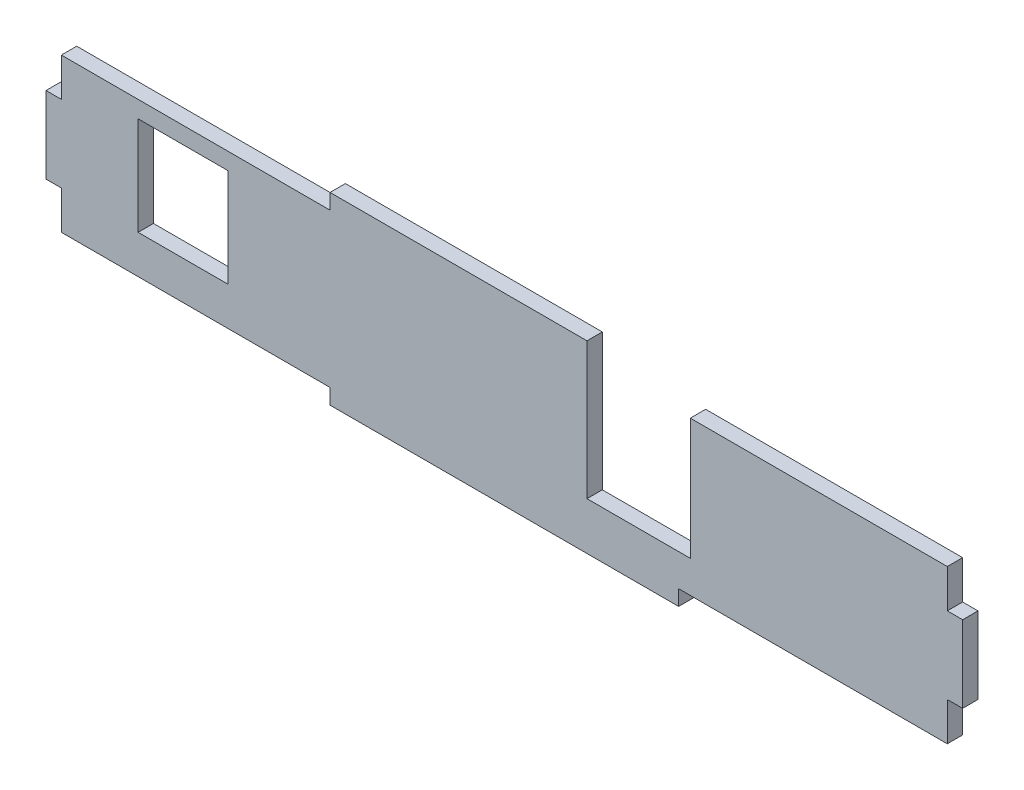
ISO-10303-21;
HEADER;
FILE_DESCRIPTION(('STEP AP214'),'2;1');
FILE_NAME('part.step','',(''),(''),'','','');
FILE_SCHEMA(('AUTOMOTIVE_DESIGN { 1 0 10303 214 1 1 1 1 }'));
ENDSEC;
DATA;
#1=APPLICATION_CONTEXT('core data for automotive mechanical design processes');
#2=APPLICATION_PROTOCOL_DEFINITION('international standard','automotive_design',2000,#1);
#3=PRODUCT_CONTEXT('',#1,'mechanical');
#4=PRODUCT('Part','Part','',(#3));
#5=PRODUCT_RELATED_PRODUCT_CATEGORY('part','',(#4));
#6=PRODUCT_DEFINITION_FORMATION('','',#4);
#7=PRODUCT_DEFINITION_CONTEXT('part definition',#1,'design');
#8=PRODUCT_DEFINITION('design','',#6,#7);
#9=PRODUCT_DEFINITION_SHAPE('','',#8);
#10=(LENGTH_UNIT() NAMED_UNIT(*) SI_UNIT(.MILLI.,.METRE.));
#11=(NAMED_UNIT(*) PLANE_ANGLE_UNIT() SI_UNIT($,.RADIAN.));
#12=(NAMED_UNIT(*) SI_UNIT($,.STERADIAN.) SOLID_ANGLE_UNIT());
#13=UNCERTAINTY_MEASURE_WITH_UNIT(LENGTH_MEASURE(1.E-05),#10,'distance_accuracy_value','');
#14=(GEOMETRIC_REPRESENTATION_CONTEXT(3) GLOBAL_UNCERTAINTY_ASSIGNED_CONTEXT((#13)) GLOBAL_UNIT_ASSIGNED_CONTEXT((#10,
#11,#12)) REPRESENTATION_CONTEXT('',''));
#15=CARTESIAN_POINT('',(0.,0.,0.));
#16=DIRECTION('',(0.,0.,1.));
#17=DIRECTION('',(1.,0.,0.));
#18=AXIS2_PLACEMENT_3D('',#15,#16,#17);
#19=CARTESIAN_POINT('',(0.,0.,2.));
#20=DIRECTION('',(0.,0.,1.));
#21=DIRECTION('',(1.,0.,0.));
#22=AXIS2_PLACEMENT_3D('',#19,#20,#21);
#23=PLANE('',#22);
#24=DIRECTION('',(0.,-1.,0.));
#25=VECTOR('',#24,1.);
#26=CARTESIAN_POINT('',(0.,0.,2.));
#27=LINE('',#26,#25);
#28=CARTESIAN_POINT('',(0.,5.,2.));
#29=VERTEX_POINT('',#28);
#30=CARTESIAN_POINT('',(0.,0.,2.));
#31=VERTEX_POINT('',#30);
#32=EDGE_CURVE('E244',#29,#31,#27,.T.);
#33=ORIENTED_EDGE('',*,*,#32,.T.);
#34=DIRECTION('',(1.,0.,0.));
#35=VECTOR('',#34,1.);
#36=CARTESIAN_POINT('',(0.,0.,2.));
#37=LINE('',#36,#35);
#38=CARTESIAN_POINT('',(35.,0.,2.));
#39=VERTEX_POINT('',#38);
#40=EDGE_CURVE('E247',#31,#39,#37,.T.);
#41=ORIENTED_EDGE('',*,*,#40,.T.);
#42=DIRECTION('',(0.,-1.,0.));
#43=VECTOR('',#42,1.);
#44=CARTESIAN_POINT('',(35.,0.,2.));
#45=LINE('',#44,#43);
#46=CARTESIAN_POINT('',(35.,-2.00047159609551,2.));
#47=VERTEX_POINT('',#46);
#48=EDGE_CURVE('E250',#39,#47,#45,.T.);
#49=ORIENTED_EDGE('',*,*,#48,.T.);
#50=DIRECTION('',(1.,0.,0.));
#51=VECTOR('',#50,1.);
#52=CARTESIAN_POINT('',(35.,-2.00047159609551,2.));
#53=LINE('',#52,#51);
#54=CARTESIAN_POINT('',(80.41,-2.00047159609551,2.));
#55=VERTEX_POINT('',#54);
#56=EDGE_CURVE('E252',#47,#55,#53,.T.);
#57=ORIENTED_EDGE('',*,*,#56,.T.);
#58=DIRECTION('',(0.,1.,0.));
#59=VECTOR('',#58,1.);
#60=CARTESIAN_POINT('',(80.41,-2.00047159609551,2.));
#61=LINE('',#60,#59);
#62=CARTESIAN_POINT('',(80.41,0.,2.));
#63=VERTEX_POINT('',#62);
#64=EDGE_CURVE('E254',#55,#63,#61,.T.);
#65=ORIENTED_EDGE('',*,*,#64,.T.);
#66=DIRECTION('',(1.,0.,0.));
#67=VECTOR('',#66,1.);
#68=CARTESIAN_POINT('',(80.41,0.,2.));
#69=LINE('',#68,#67);
#70=CARTESIAN_POINT('',(115.41,0.,2.));
#71=VERTEX_POINT('',#70);
#72=EDGE_CURVE('E256',#63,#71,#69,.T.);
#73=ORIENTED_EDGE('',*,*,#72,.T.);
#74=DIRECTION('',(0.,1.,0.));
#75=VECTOR('',#74,1.);
#76=CARTESIAN_POINT('',(115.41,0.,2.));
#77=LINE('',#76,#75);
#78=CARTESIAN_POINT('',(115.41,5.,2.));
#79=VERTEX_POINT('',#78);
#80=EDGE_CURVE('E258',#71,#79,#77,.T.);
#81=ORIENTED_EDGE('',*,*,#80,.T.);
#82=DIRECTION('',(1.,0.,0.));
#83=VECTOR('',#82,1.);
#84=CARTESIAN_POINT('',(115.41,5.,2.));
#85=LINE('',#84,#83);
#86=CARTESIAN_POINT('',(117.41,5.,2.));
#87=VERTEX_POINT('',#86);
#88=EDGE_CURVE('E260',#79,#87,#85,.T.);
#89=ORIENTED_EDGE('',*,*,#88,.T.);
#90=DIRECTION('',(0.,1.,0.));
#91=VECTOR('',#90,1.);
#92=CARTESIAN_POINT('',(117.41,5.,2.));
#93=LINE('',#92,#91);
#94=CARTESIAN_POINT('',(117.41,15.,2.));
#95=VERTEX_POINT('',#94);
#96=EDGE_CURVE('E262',#87,#95,#93,.T.);
#97=ORIENTED_EDGE('',*,*,#96,.T.);
#98=DIRECTION('',(-1.,0.,0.));
#99=VECTOR('',#98,1.);
#100=CARTESIAN_POINT('',(117.41,15.,2.));
#101=LINE('',#100,#99);
#102=CARTESIAN_POINT('',(115.409999943228,15.,2.));
#103=VERTEX_POINT('',#102);
#104=EDGE_CURVE('E264',#95,#103,#101,.T.);
#105=ORIENTED_EDGE('',*,*,#104,.T.);
#106=DIRECTION('',(0.,1.,0.));
#107=VECTOR('',#106,1.);
#108=CARTESIAN_POINT('',(115.409999943228,15.,2.));
#109=LINE('',#108,#107);
#110=CARTESIAN_POINT('',(115.409999943228,20.0036199747844,2.));
#111=VERTEX_POINT('',#110);
#112=EDGE_CURVE('E266',#103,#111,#109,.T.);
#113=ORIENTED_EDGE('',*,*,#112,.T.);
#114=DIRECTION('',(-1.,0.,0.));
#115=VECTOR('',#114,1.);
#116=CARTESIAN_POINT('',(81.9297207735588,20.0036199747844,2.));
#117=LINE('',#116,#115);
#118=CARTESIAN_POINT('',(81.9297207735588,20.0036199747844,2.));
#119=VERTEX_POINT('',#118);
#120=EDGE_CURVE('E268',#111,#119,#117,.T.);
#121=ORIENTED_EDGE('',*,*,#120,.T.);
#122=DIRECTION('',(0.,-1.,0.));
#123=VECTOR('',#122,1.);
#124=CARTESIAN_POINT('',(81.9297207735588,20.0036199747844,2.));
#125=LINE('',#124,#123);
#126=CARTESIAN_POINT('',(81.9297207735588,4.18921696791718,2.));
#127=VERTEX_POINT('',#126);
#128=EDGE_CURVE('E270',#119,#127,#125,.T.);
#129=ORIENTED_EDGE('',*,*,#128,.T.);
#130=DIRECTION('',(-1.,0.,0.));
#131=VECTOR('',#130,1.);
#132=CARTESIAN_POINT('',(68.4730931683228,4.18921696791718,2.));
#133=LINE('',#132,#131);
#134=CARTESIAN_POINT('',(68.4730931683228,4.18921696791718,2.));
#135=VERTEX_POINT('',#134);
#136=EDGE_CURVE('E272',#127,#135,#133,.T.);
#137=ORIENTED_EDGE('',*,*,#136,.T.);
#138=DIRECTION('',(0.,1.,0.));
#139=VECTOR('',#138,1.);
#140=CARTESIAN_POINT('',(68.4730931683228,4.18921696791718,2.));
#141=LINE('',#140,#139);
#142=CARTESIAN_POINT('',(68.4730931683228,22.,2.));
#143=VERTEX_POINT('',#142);
#144=EDGE_CURVE('E274',#135,#143,#141,.T.);
#145=ORIENTED_EDGE('',*,*,#144,.T.);
#146=DIRECTION('',(-1.,0.,0.));
#147=VECTOR('',#146,1.);
#148=CARTESIAN_POINT('',(35.,22.,2.));
#149=LINE('',#148,#147);
#150=CARTESIAN_POINT('',(35.,22.,2.));
#151=VERTEX_POINT('',#150);
#152=EDGE_CURVE('E276',#143,#151,#149,.T.);
#153=ORIENTED_EDGE('',*,*,#152,.T.);
#154=DIRECTION('',(0.,-1.,0.));
#155=VECTOR('',#154,1.);
#156=CARTESIAN_POINT('',(35.,22.,2.));
#157=LINE('',#156,#155);
#158=CARTESIAN_POINT('',(35.,20.,2.));
#159=VERTEX_POINT('',#158);
#160=EDGE_CURVE('E278',#151,#159,#157,.T.);
#161=ORIENTED_EDGE('',*,*,#160,.T.);
#162=DIRECTION('',(-1.,0.,0.));
#163=VECTOR('',#162,1.);
#164=CARTESIAN_POINT('',(0.,20.,2.));
#165=LINE('',#164,#163);
#166=CARTESIAN_POINT('',(0.,20.,2.));
#167=VERTEX_POINT('',#166);
#168=EDGE_CURVE('E280',#159,#167,#165,.T.);
#169=ORIENTED_EDGE('',*,*,#168,.T.);
#170=DIRECTION('',(0.,-1.,0.));
#171=VECTOR('',#170,1.);
#172=CARTESIAN_POINT('',(0.,15.,2.));
#173=LINE('',#172,#171);
#174=CARTESIAN_POINT('',(0.,15.,2.));
#175=VERTEX_POINT('',#174);
#176=EDGE_CURVE('E282',#167,#175,#173,.T.);
#177=ORIENTED_EDGE('',*,*,#176,.T.);
#178=DIRECTION('',(-1.,0.,0.));
#179=VECTOR('',#178,1.);
#180=CARTESIAN_POINT('',(-2.,15.,2.));
#181=LINE('',#180,#179);
#182=CARTESIAN_POINT('',(-2.,15.,2.));
#183=VERTEX_POINT('',#182);
#184=EDGE_CURVE('E284',#175,#183,#181,.T.);
#185=ORIENTED_EDGE('',*,*,#184,.T.);
#186=DIRECTION('',(0.,-1.,0.));
#187=VECTOR('',#186,1.);
#188=CARTESIAN_POINT('',(-2.,5.,2.));
#189=LINE('',#188,#187);
#190=CARTESIAN_POINT('',(-2.,5.,2.));
#191=VERTEX_POINT('',#190);
#192=EDGE_CURVE('E286',#183,#191,#189,.T.);
#193=ORIENTED_EDGE('',*,*,#192,.T.);
#194=DIRECTION('',(1.,0.,0.));
#195=VECTOR('',#194,1.);
#196=CARTESIAN_POINT('',(0.,5.,2.));
#197=LINE('',#196,#195);
#198=EDGE_CURVE('E288',#191,#29,#197,.T.);
#199=ORIENTED_EDGE('',*,*,#198,.T.);
#200=EDGE_LOOP('',(#33,#41,#49,#57,#65,#73,#81,#89,#97,#105,#113,#121,#129,#137,#145,#153,#161,
#169,#177,#185,#193,#199));
#201=FACE_BOUND('',#200,.T.);
#202=DIRECTION('',(1.,0.,0.));
#203=VECTOR('',#202,1.);
#204=CARTESIAN_POINT('',(10.,5.,2.));
#205=LINE('',#204,#203);
#206=CARTESIAN_POINT('',(10.,5.,2.));
#207=VERTEX_POINT('',#206);
#208=CARTESIAN_POINT('',(21.695168442494,5.,2.));
#209=VERTEX_POINT('',#208);
#210=EDGE_CURVE('E216',#207,#209,#205,.T.);
#211=ORIENTED_EDGE('',*,*,#210,.F.);
#212=DIRECTION('',(0.,-1.,0.));
#213=VECTOR('',#212,1.);
#214=CARTESIAN_POINT('',(10.,5.,2.));
#215=LINE('',#214,#213);
#216=CARTESIAN_POINT('',(10.,17.8079444644972,2.));
#217=VERTEX_POINT('',#216);
#218=EDGE_CURVE('E208',#217,#207,#215,.T.);
#219=ORIENTED_EDGE('',*,*,#218,.F.);
#220=DIRECTION('',(-1.,0.,0.));
#221=VECTOR('',#220,1.);
#222=CARTESIAN_POINT('',(10.,17.8079444644972,2.));
#223=LINE('',#222,#221);
#224=CARTESIAN_POINT('',(21.695168442494,17.8079444644972,2.));
#225=VERTEX_POINT('',#224);
#226=EDGE_CURVE('E230',#225,#217,#223,.T.);
#227=ORIENTED_EDGE('',*,*,#226,.F.);
#228=DIRECTION('',(0.,1.,0.));
#229=VECTOR('',#228,1.);
#230=CARTESIAN_POINT('',(21.695168442494,5.,2.));
#231=LINE('',#230,#229);
#232=EDGE_CURVE('E228',#209,#225,#231,.T.);
#233=ORIENTED_EDGE('',*,*,#232,.F.);
#234=EDGE_LOOP('',(#211,#219,#227,#233));
#235=FACE_BOUND('',#234,.T.);
#236=ADVANCED_FACE('F35',(#201,#235),#23,.T.);
#237=CARTESIAN_POINT('',(0.,0.,0.));
#238=DIRECTION('',(0.,0.,1.));
#239=DIRECTION('',(1.,0.,0.));
#240=AXIS2_PLACEMENT_3D('',#237,#238,#239);
#241=PLANE('',#240);
#242=DIRECTION('',(0.,-1.,0.));
#243=VECTOR('',#242,1.);
#244=CARTESIAN_POINT('',(0.,0.,0.));
#245=LINE('',#244,#243);
#246=CARTESIAN_POINT('',(0.,5.,0.));
#247=VERTEX_POINT('',#246);
#248=CARTESIAN_POINT('',(0.,0.,0.));
#249=VERTEX_POINT('',#248);
#250=EDGE_CURVE('E224',#247,#249,#245,.T.);
#251=ORIENTED_EDGE('',*,*,#250,.F.);
#252=DIRECTION('',(1.,0.,0.));
#253=VECTOR('',#252,1.);
#254=CARTESIAN_POINT('',(0.,5.,0.));
#255=LINE('',#254,#253);
#256=CARTESIAN_POINT('',(-2.,5.,0.));
#257=VERTEX_POINT('',#256);
#258=EDGE_CURVE('E248',#257,#247,#255,.T.);
#259=ORIENTED_EDGE('',*,*,#258,.F.);
#260=DIRECTION('',(0.,-1.,0.));
#261=VECTOR('',#260,1.);
#262=CARTESIAN_POINT('',(-2.,5.,0.));
#263=LINE('',#262,#261);
#264=CARTESIAN_POINT('',(-2.,15.,0.));
#265=VERTEX_POINT('',#264);
#266=EDGE_CURVE('E332',#265,#257,#263,.T.);
#267=ORIENTED_EDGE('',*,*,#266,.F.);
#268=DIRECTION('',(-1.,0.,0.));
#269=VECTOR('',#268,1.);
#270=CARTESIAN_POINT('',(-2.,15.,0.));
#271=LINE('',#270,#269);
#272=CARTESIAN_POINT('',(0.,15.,0.));
#273=VERTEX_POINT('',#272);
#274=EDGE_CURVE('E330',#273,#265,#271,.T.);
#275=ORIENTED_EDGE('',*,*,#274,.F.);
#276=DIRECTION('',(0.,-1.,0.));
#277=VECTOR('',#276,1.);
#278=CARTESIAN_POINT('',(0.,15.,0.));
#279=LINE('',#278,#277);
#280=CARTESIAN_POINT('',(0.,20.,0.));
#281=VERTEX_POINT('',#280);
#282=EDGE_CURVE('E328',#281,#273,#279,.T.);
#283=ORIENTED_EDGE('',*,*,#282,.F.);
#284=DIRECTION('',(-1.,0.,0.));
#285=VECTOR('',#284,1.);
#286=CARTESIAN_POINT('',(0.,20.,0.));
#287=LINE('',#286,#285);
#288=CARTESIAN_POINT('',(35.,20.,0.));
#289=VERTEX_POINT('',#288);
#290=EDGE_CURVE('E326',#289,#281,#287,.T.);
#291=ORIENTED_EDGE('',*,*,#290,.F.);
#292=DIRECTION('',(0.,-1.,0.));
#293=VECTOR('',#292,1.);
#294=CARTESIAN_POINT('',(35.,22.,0.));
#295=LINE('',#294,#293);
#296=CARTESIAN_POINT('',(35.,22.,0.));
#297=VERTEX_POINT('',#296);
#298=EDGE_CURVE('E324',#297,#289,#295,.T.);
#299=ORIENTED_EDGE('',*,*,#298,.F.);
#300=DIRECTION('',(-1.,0.,0.));
#301=VECTOR('',#300,1.);
#302=CARTESIAN_POINT('',(35.,22.,0.));
#303=LINE('',#302,#301);
#304=CARTESIAN_POINT('',(68.4730931683228,22.,0.));
#305=VERTEX_POINT('',#304);
#306=EDGE_CURVE('E322',#305,#297,#303,.T.);
#307=ORIENTED_EDGE('',*,*,#306,.F.);
#308=DIRECTION('',(0.,1.,0.));
#309=VECTOR('',#308,1.);
#310=CARTESIAN_POINT('',(68.4730931683228,19.9510677717534,0.));
#311=LINE('',#310,#309);
#312=CARTESIAN_POINT('',(68.4730931683228,4.18921696791718,0.));
#313=VERTEX_POINT('',#312);
#314=EDGE_CURVE('E320',#313,#305,#311,.T.);
#315=ORIENTED_EDGE('',*,*,#314,.F.);
#316=DIRECTION('',(-1.,0.,0.));
#317=VECTOR('',#316,1.);
#318=CARTESIAN_POINT('',(68.4730931683228,4.18921696791718,0.));
#319=LINE('',#318,#317);
#320=CARTESIAN_POINT('',(81.9297207735588,4.18921696791718,0.));
#321=VERTEX_POINT('',#320);
#322=EDGE_CURVE('E317',#321,#313,#319,.T.);
#323=ORIENTED_EDGE('',*,*,#322,.F.);
#324=DIRECTION('',(0.,-1.,0.));
#325=VECTOR('',#324,1.);
#326=CARTESIAN_POINT('',(81.9297207735588,20.0036199747844,0.));
#327=LINE('',#326,#325);
#328=CARTESIAN_POINT('',(81.9297207735588,20.0036199747844,0.));
#329=VERTEX_POINT('',#328);
#330=EDGE_CURVE('E315',#329,#321,#327,.T.);
#331=ORIENTED_EDGE('',*,*,#330,.F.);
#332=DIRECTION('',(-1.,0.,0.));
#333=VECTOR('',#332,1.);
#334=CARTESIAN_POINT('',(81.9297207735588,20.0036199747844,0.));
#335=LINE('',#334,#333);
#336=CARTESIAN_POINT('',(115.409999943228,20.0036199747844,0.));
#337=VERTEX_POINT('',#336);
#338=EDGE_CURVE('E313',#337,#329,#335,.T.);
#339=ORIENTED_EDGE('',*,*,#338,.F.);
#340=DIRECTION('',(0.,1.,0.));
#341=VECTOR('',#340,1.);
#342=CARTESIAN_POINT('',(115.409999943228,15.,0.));
#343=LINE('',#342,#341);
#344=CARTESIAN_POINT('',(115.409999943228,15.,0.));
#345=VERTEX_POINT('',#344);
#346=EDGE_CURVE('E311',#345,#337,#343,.T.);
#347=ORIENTED_EDGE('',*,*,#346,.F.);
#348=DIRECTION('',(-1.,0.,0.));
#349=VECTOR('',#348,1.);
#350=CARTESIAN_POINT('',(117.41,15.,0.));
#351=LINE('',#350,#349);
#352=CARTESIAN_POINT('',(117.41,15.,0.));
#353=VERTEX_POINT('',#352);
#354=EDGE_CURVE('E309',#353,#345,#351,.T.);
#355=ORIENTED_EDGE('',*,*,#354,.F.);
#356=DIRECTION('',(0.,1.,0.));
#357=VECTOR('',#356,1.);
#358=CARTESIAN_POINT('',(117.41,5.,0.));
#359=LINE('',#358,#357);
#360=CARTESIAN_POINT('',(117.41,5.,0.));
#361=VERTEX_POINT('',#360);
#362=EDGE_CURVE('E307',#361,#353,#359,.T.);
#363=ORIENTED_EDGE('',*,*,#362,.F.);
#364=DIRECTION('',(1.,0.,0.));
#365=VECTOR('',#364,1.);
#366=CARTESIAN_POINT('',(115.41,5.,0.));
#367=LINE('',#366,#365);
#368=CARTESIAN_POINT('',(115.41,5.,0.));
#369=VERTEX_POINT('',#368);
#370=EDGE_CURVE('E305',#369,#361,#367,.T.);
#371=ORIENTED_EDGE('',*,*,#370,.F.);
#372=DIRECTION('',(0.,1.,0.));
#373=VECTOR('',#372,1.);
#374=CARTESIAN_POINT('',(115.41,0.,0.));
#375=LINE('',#374,#373);
#376=CARTESIAN_POINT('',(115.41,0.,0.));
#377=VERTEX_POINT('',#376);
#378=EDGE_CURVE('E303',#377,#369,#375,.T.);
#379=ORIENTED_EDGE('',*,*,#378,.F.);
#380=DIRECTION('',(1.,0.,0.));
#381=VECTOR('',#380,1.);
#382=CARTESIAN_POINT('',(80.41,0.,0.));
#383=LINE('',#382,#381);
#384=CARTESIAN_POINT('',(80.41,0.,0.));
#385=VERTEX_POINT('',#384);
#386=EDGE_CURVE('E301',#385,#377,#383,.T.);
#387=ORIENTED_EDGE('',*,*,#386,.F.);
#388=DIRECTION('',(0.,1.,0.));
#389=VECTOR('',#388,1.);
#390=CARTESIAN_POINT('',(80.41,-2.00047159609551,0.));
#391=LINE('',#390,#389);
#392=CARTESIAN_POINT('',(80.41,-2.00047159609551,0.));
#393=VERTEX_POINT('',#392);
#394=EDGE_CURVE('E299',#393,#385,#391,.T.);
#395=ORIENTED_EDGE('',*,*,#394,.F.);
#396=DIRECTION('',(1.,0.,0.));
#397=VECTOR('',#396,1.);
#398=CARTESIAN_POINT('',(35.,-2.00047159609551,0.));
#399=LINE('',#398,#397);
#400=CARTESIAN_POINT('',(35.,-2.00047159609551,0.));
#401=VERTEX_POINT('',#400);
#402=EDGE_CURVE('E297',#401,#393,#399,.T.);
#403=ORIENTED_EDGE('',*,*,#402,.F.);
#404=DIRECTION('',(0.,-1.,0.));
#405=VECTOR('',#404,1.);
#406=CARTESIAN_POINT('',(35.,0.,0.));
#407=LINE('',#406,#405);
#408=CARTESIAN_POINT('',(35.,0.,0.));
#409=VERTEX_POINT('',#408);
#410=EDGE_CURVE('E295',#409,#401,#407,.T.);
#411=ORIENTED_EDGE('',*,*,#410,.F.);
#412=DIRECTION('',(1.,0.,0.));
#413=VECTOR('',#412,1.);
#414=CARTESIAN_POINT('',(0.,0.,0.));
#415=LINE('',#414,#413);
#416=EDGE_CURVE('E293',#249,#409,#415,.T.);
#417=ORIENTED_EDGE('',*,*,#416,.F.);
#418=EDGE_LOOP('',(#251,#259,#267,#275,#283,#291,#299,#307,#315,#323,#331,#339,#347,#355,#363,
#371,#379,#387,#395,#403,#411,#417));
#419=FACE_BOUND('',#418,.T.);
#420=DIRECTION('',(0.,-1.,0.));
#421=VECTOR('',#420,1.);
#422=CARTESIAN_POINT('',(10.,5.,0.));
#423=LINE('',#422,#421);
#424=CARTESIAN_POINT('',(10.,17.8079444644972,0.));
#425=VERTEX_POINT('',#424);
#426=CARTESIAN_POINT('',(10.,5.,0.));
#427=VERTEX_POINT('',#426);
#428=EDGE_CURVE('E58',#425,#427,#423,.T.);
#429=ORIENTED_EDGE('',*,*,#428,.T.);
#430=DIRECTION('',(1.,0.,0.));
#431=VECTOR('',#430,1.);
#432=CARTESIAN_POINT('',(10.,5.,0.));
#433=LINE('',#432,#431);
#434=CARTESIAN_POINT('',(21.695168442494,5.,0.));
#435=VERTEX_POINT('',#434);
#436=EDGE_CURVE('E223',#427,#435,#433,.T.);
#437=ORIENTED_EDGE('',*,*,#436,.T.);
#438=DIRECTION('',(0.,1.,0.));
#439=VECTOR('',#438,1.);
#440=CARTESIAN_POINT('',(21.695168442494,5.,0.));
#441=LINE('',#440,#439);
#442=CARTESIAN_POINT('',(21.695168442494,17.8079444644972,0.));
#443=VERTEX_POINT('',#442);
#444=EDGE_CURVE('E236',#435,#443,#441,.T.);
#445=ORIENTED_EDGE('',*,*,#444,.T.);
#446=DIRECTION('',(-1.,0.,0.));
#447=VECTOR('',#446,1.);
#448=CARTESIAN_POINT('',(10.,17.8079444644972,0.));
#449=LINE('',#448,#447);
#450=EDGE_CURVE('E217',#443,#425,#449,.T.);
#451=ORIENTED_EDGE('',*,*,#450,.T.);
#452=EDGE_LOOP('',(#429,#437,#445,#451));
#453=FACE_BOUND('',#452,.T.);
#454=ADVANCED_FACE('F404',(#419,#453),#241,.F.);
#455=CARTESIAN_POINT('',(0.,0.,2.));
#456=DIRECTION('',(1.,0.,0.));
#457=DIRECTION('',(0.,0.,-1.));
#458=AXIS2_PLACEMENT_3D('',#455,#456,#457);
#459=PLANE('',#458);
#460=ORIENTED_EDGE('',*,*,#250,.T.);
#461=DIRECTION('',(0.,0.,-1.));
#462=VECTOR('',#461,1.);
#463=CARTESIAN_POINT('',(0.,0.,2.));
#464=LINE('',#463,#462);
#465=EDGE_CURVE('E11',#31,#249,#464,.T.);
#466=ORIENTED_EDGE('',*,*,#465,.F.);
#467=ORIENTED_EDGE('',*,*,#32,.F.);
#468=DIRECTION('',(0.,0.,-1.));
#469=VECTOR('',#468,1.);
#470=CARTESIAN_POINT('',(0.,5.,2.));
#471=LINE('',#470,#469);
#472=EDGE_CURVE('E290',#29,#247,#471,.T.);
#473=ORIENTED_EDGE('',*,*,#472,.T.);
#474=EDGE_LOOP('',(#460,#466,#467,#473));
#475=FACE_BOUND('',#474,.T.);
#476=ADVANCED_FACE('F37',(#475),#459,.F.);
#477=CARTESIAN_POINT('',(0.,0.,2.));
#478=DIRECTION('',(0.,1.,0.));
#479=DIRECTION('',(0.,0.,1.));
#480=AXIS2_PLACEMENT_3D('',#477,#478,#479);
#481=PLANE('',#480);
#482=ORIENTED_EDGE('',*,*,#416,.T.);
#483=DIRECTION('',(0.,0.,-1.));
#484=VECTOR('',#483,1.);
#485=CARTESIAN_POINT('',(35.,0.,2.));
#486=LINE('',#485,#484);
#487=EDGE_CURVE('E43',#39,#409,#486,.T.);
#488=ORIENTED_EDGE('',*,*,#487,.F.);
#489=ORIENTED_EDGE('',*,*,#40,.F.);
#490=ORIENTED_EDGE('',*,*,#465,.T.);
#491=EDGE_LOOP('',(#482,#488,#489,#490));
#492=FACE_BOUND('',#491,.T.);
#493=ADVANCED_FACE('F421',(#492),#481,.F.);
#494=CARTESIAN_POINT('',(35.,0.,2.));
#495=DIRECTION('',(1.,0.,0.));
#496=DIRECTION('',(0.,0.,-1.));
#497=AXIS2_PLACEMENT_3D('',#494,#495,#496);
#498=PLANE('',#497);
#499=ORIENTED_EDGE('',*,*,#410,.T.);
#500=DIRECTION('',(0.,0.,-1.));
#501=VECTOR('',#500,1.);
#502=CARTESIAN_POINT('',(35.,-2.00047159609551,2.));
#503=LINE('',#502,#501);
#504=EDGE_CURVE('E391',#47,#401,#503,.T.);
#505=ORIENTED_EDGE('',*,*,#504,.F.);
#506=ORIENTED_EDGE('',*,*,#48,.F.);
#507=ORIENTED_EDGE('',*,*,#487,.T.);
#508=EDGE_LOOP('',(#499,#505,#506,#507));
#509=FACE_BOUND('',#508,.T.);
#510=ADVANCED_FACE('F398',(#509),#498,.F.);
#511=CARTESIAN_POINT('',(35.,-2.00047159609551,2.));
#512=DIRECTION('',(0.,1.,0.));
#513=DIRECTION('',(0.,0.,1.));
#514=AXIS2_PLACEMENT_3D('',#511,#512,#513);
#515=PLANE('',#514);
#516=ORIENTED_EDGE('',*,*,#402,.T.);
#517=DIRECTION('',(0.,0.,-1.));
#518=VECTOR('',#517,1.);
#519=CARTESIAN_POINT('',(80.41,-2.00047159609551,2.));
#520=LINE('',#519,#518);
#521=EDGE_CURVE('E388',#55,#393,#520,.T.);
#522=ORIENTED_EDGE('',*,*,#521,.F.);
#523=ORIENTED_EDGE('',*,*,#56,.F.);
#524=ORIENTED_EDGE('',*,*,#504,.T.);
#525=EDGE_LOOP('',(#516,#522,#523,#524));
#526=FACE_BOUND('',#525,.T.);
#527=ADVANCED_FACE('F410',(#526),#515,.F.);
#528=CARTESIAN_POINT('',(80.41,-2.00047159609551,2.));
#529=DIRECTION('',(-1.,0.,0.));
#530=DIRECTION('',(0.,0.,1.));
#531=AXIS2_PLACEMENT_3D('',#528,#529,#530);
#532=PLANE('',#531);
#533=ORIENTED_EDGE('',*,*,#394,.T.);
#534=DIRECTION('',(0.,0.,-1.));
#535=VECTOR('',#534,1.);
#536=CARTESIAN_POINT('',(80.41,0.,2.));
#537=LINE('',#536,#535);
#538=EDGE_CURVE('E385',#63,#385,#537,.T.);
#539=ORIENTED_EDGE('',*,*,#538,.F.);
#540=ORIENTED_EDGE('',*,*,#64,.F.);
#541=ORIENTED_EDGE('',*,*,#521,.T.);
#542=EDGE_LOOP('',(#533,#539,#540,#541));
#543=FACE_BOUND('',#542,.T.);
#544=ADVANCED_FACE('F414',(#543),#532,.F.);
#545=CARTESIAN_POINT('',(80.41,0.,2.));
#546=DIRECTION('',(0.,1.,0.));
#547=DIRECTION('',(0.,0.,1.));
#548=AXIS2_PLACEMENT_3D('',#545,#546,#547);
#549=PLANE('',#548);
#550=ORIENTED_EDGE('',*,*,#386,.T.);
#551=DIRECTION('',(0.,0.,-1.));
#552=VECTOR('',#551,1.);
#553=CARTESIAN_POINT('',(115.41,0.,2.));
#554=LINE('',#553,#552);
#555=EDGE_CURVE('E382',#71,#377,#554,.T.);
#556=ORIENTED_EDGE('',*,*,#555,.F.);
#557=ORIENTED_EDGE('',*,*,#72,.F.);
#558=ORIENTED_EDGE('',*,*,#538,.T.);
#559=EDGE_LOOP('',(#550,#556,#557,#558));
#560=FACE_BOUND('',#559,.T.);
#561=ADVANCED_FACE('F503',(#560),#549,.F.);
#562=CARTESIAN_POINT('',(115.41,0.,2.));
#563=DIRECTION('',(-1.,0.,0.));
#564=DIRECTION('',(0.,0.,1.));
#565=AXIS2_PLACEMENT_3D('',#562,#563,#564);
#566=PLANE('',#565);
#567=ORIENTED_EDGE('',*,*,#378,.T.);
#568=DIRECTION('',(0.,0.,-1.));
#569=VECTOR('',#568,1.);
#570=CARTESIAN_POINT('',(115.41,5.,2.));
#571=LINE('',#570,#569);
#572=EDGE_CURVE('E379',#79,#369,#571,.T.);
#573=ORIENTED_EDGE('',*,*,#572,.F.);
#574=ORIENTED_EDGE('',*,*,#80,.F.);
#575=ORIENTED_EDGE('',*,*,#555,.T.);
#576=EDGE_LOOP('',(#567,#573,#574,#575));
#577=FACE_BOUND('',#576,.T.);
#578=ADVANCED_FACE('F500',(#577),#566,.F.);
#579=CARTESIAN_POINT('',(115.41,5.,2.));
#580=DIRECTION('',(0.,1.,0.));
#581=DIRECTION('',(0.,0.,1.));
#582=AXIS2_PLACEMENT_3D('',#579,#580,#581);
#583=PLANE('',#582);
#584=ORIENTED_EDGE('',*,*,#370,.T.);
#585=DIRECTION('',(0.,0.,-1.));
#586=VECTOR('',#585,1.);
#587=CARTESIAN_POINT('',(117.41,5.,2.));
#588=LINE('',#587,#586);
#589=EDGE_CURVE('E376',#87,#361,#588,.T.);
#590=ORIENTED_EDGE('',*,*,#589,.F.);
#591=ORIENTED_EDGE('',*,*,#88,.F.);
#592=ORIENTED_EDGE('',*,*,#572,.T.);
#593=EDGE_LOOP('',(#584,#590,#591,#592));
#594=FACE_BOUND('',#593,.T.);
#595=ADVANCED_FACE('F496',(#594),#583,.F.);
#596=CARTESIAN_POINT('',(117.41,5.,2.));
#597=DIRECTION('',(-1.,0.,0.));
#598=DIRECTION('',(0.,0.,1.));
#599=AXIS2_PLACEMENT_3D('',#596,#597,#598);
#600=PLANE('',#599);
#601=ORIENTED_EDGE('',*,*,#362,.T.);
#602=DIRECTION('',(0.,0.,-1.));
#603=VECTOR('',#602,1.);
#604=CARTESIAN_POINT('',(117.41,15.,2.));
#605=LINE('',#604,#603);
#606=EDGE_CURVE('E373',#95,#353,#605,.T.);
#607=ORIENTED_EDGE('',*,*,#606,.F.);
#608=ORIENTED_EDGE('',*,*,#96,.F.);
#609=ORIENTED_EDGE('',*,*,#589,.T.);
#610=EDGE_LOOP('',(#601,#607,#608,#609));
#611=FACE_BOUND('',#610,.T.);
#612=ADVANCED_FACE('F492',(#611),#600,.F.);
#613=CARTESIAN_POINT('',(117.41,15.,2.));
#614=DIRECTION('',(0.,-1.,0.));
#615=DIRECTION('',(0.,0.,-1.));
#616=AXIS2_PLACEMENT_3D('',#613,#614,#615);
#617=PLANE('',#616);
#618=ORIENTED_EDGE('',*,*,#354,.T.);
#619=DIRECTION('',(0.,0.,-1.));
#620=VECTOR('',#619,1.);
#621=CARTESIAN_POINT('',(115.409999943228,15.,2.));
#622=LINE('',#621,#620);
#623=EDGE_CURVE('E370',#103,#345,#622,.T.);
#624=ORIENTED_EDGE('',*,*,#623,.F.);
#625=ORIENTED_EDGE('',*,*,#104,.F.);
#626=ORIENTED_EDGE('',*,*,#606,.T.);
#627=EDGE_LOOP('',(#618,#624,#625,#626));
#628=FACE_BOUND('',#627,.T.);
#629=ADVANCED_FACE('F487',(#628),#617,.F.);
#630=CARTESIAN_POINT('',(115.409999943228,15.,2.));
#631=DIRECTION('',(-1.,0.,0.));
#632=DIRECTION('',(0.,0.,1.));
#633=AXIS2_PLACEMENT_3D('',#630,#631,#632);
#634=PLANE('',#633);
#635=ORIENTED_EDGE('',*,*,#346,.T.);
#636=DIRECTION('',(0.,0.,-1.));
#637=VECTOR('',#636,1.);
#638=CARTESIAN_POINT('',(115.409999943228,20.0036199747844,2.));
#639=LINE('',#638,#637);
#640=EDGE_CURVE('E367',#111,#337,#639,.T.);
#641=ORIENTED_EDGE('',*,*,#640,.F.);
#642=ORIENTED_EDGE('',*,*,#112,.F.);
#643=ORIENTED_EDGE('',*,*,#623,.T.);
#644=EDGE_LOOP('',(#635,#641,#642,#643));
#645=FACE_BOUND('',#644,.T.);
#646=ADVANCED_FACE('F481',(#645),#634,.F.);
#647=CARTESIAN_POINT('',(81.9297207735588,20.0036199747844,2.));
#648=DIRECTION('',(0.,-1.,0.));
#649=DIRECTION('',(1.,0.,0.));
#650=AXIS2_PLACEMENT_3D('',#647,#648,#649);
#651=PLANE('',#650);
#652=ORIENTED_EDGE('',*,*,#338,.T.);
#653=DIRECTION('',(0.,0.,-1.));
#654=VECTOR('',#653,1.);
#655=CARTESIAN_POINT('',(81.9297207735588,20.0036199747844,2.));
#656=LINE('',#655,#654);
#657=EDGE_CURVE('E364',#119,#329,#656,.T.);
#658=ORIENTED_EDGE('',*,*,#657,.F.);
#659=ORIENTED_EDGE('',*,*,#120,.F.);
#660=ORIENTED_EDGE('',*,*,#640,.T.);
#661=EDGE_LOOP('',(#652,#658,#659,#660));
#662=FACE_BOUND('',#661,.T.);
#663=ADVANCED_FACE('F477',(#662),#651,.F.);
#664=CARTESIAN_POINT('',(81.9297207735588,20.0036199747844,2.));
#665=DIRECTION('',(1.,0.,0.));
#666=DIRECTION('',(0.,0.,-1.));
#667=AXIS2_PLACEMENT_3D('',#664,#665,#666);
#668=PLANE('',#667);
#669=ORIENTED_EDGE('',*,*,#330,.T.);
#670=DIRECTION('',(0.,0.,-1.));
#671=VECTOR('',#670,1.);
#672=CARTESIAN_POINT('',(81.9297207735588,4.18921696791718,2.));
#673=LINE('',#672,#671);
#674=EDGE_CURVE('E361',#127,#321,#673,.T.);
#675=ORIENTED_EDGE('',*,*,#674,.F.);
#676=ORIENTED_EDGE('',*,*,#128,.F.);
#677=ORIENTED_EDGE('',*,*,#657,.T.);
#678=EDGE_LOOP('',(#669,#675,#676,#677));
#679=FACE_BOUND('',#678,.T.);
#680=ADVANCED_FACE('F472',(#679),#668,.F.);
#681=CARTESIAN_POINT('',(68.4730931683228,4.18921696791718,2.));
#682=DIRECTION('',(0.,-1.,0.));
#683=DIRECTION('',(0.,0.,-1.));
#684=AXIS2_PLACEMENT_3D('',#681,#682,#683);
#685=PLANE('',#684);
#686=ORIENTED_EDGE('',*,*,#322,.T.);
#687=DIRECTION('',(0.,0.,-1.));
#688=VECTOR('',#687,1.);
#689=CARTESIAN_POINT('',(68.4730931683228,4.18921696791718,2.));
#690=LINE('',#689,#688);
#691=EDGE_CURVE('E358',#135,#313,#690,.T.);
#692=ORIENTED_EDGE('',*,*,#691,.F.);
#693=ORIENTED_EDGE('',*,*,#136,.F.);
#694=ORIENTED_EDGE('',*,*,#674,.T.);
#695=EDGE_LOOP('',(#686,#692,#693,#694));
#696=FACE_BOUND('',#695,.T.);
#697=ADVANCED_FACE('F466',(#696),#685,.F.);
#698=CARTESIAN_POINT('',(68.4730931683228,19.9510677717534,2.));
#699=DIRECTION('',(-1.,0.,0.));
#700=DIRECTION('',(0.,0.,1.));
#701=AXIS2_PLACEMENT_3D('',#698,#699,#700);
#702=PLANE('',#701);
#703=ORIENTED_EDGE('',*,*,#314,.T.);
#704=DIRECTION('',(0.,0.,-1.));
#705=VECTOR('',#704,1.);
#706=CARTESIAN_POINT('',(68.4730931683228,22.,2.));
#707=LINE('',#706,#705);
#708=EDGE_CURVE('E355',#143,#305,#707,.T.);
#709=ORIENTED_EDGE('',*,*,#708,.F.);
#710=ORIENTED_EDGE('',*,*,#144,.F.);
#711=ORIENTED_EDGE('',*,*,#691,.T.);
#712=EDGE_LOOP('',(#703,#709,#710,#711));
#713=FACE_BOUND('',#712,.T.);
#714=ADVANCED_FACE('F462',(#713),#702,.F.);
#715=CARTESIAN_POINT('',(35.,22.,2.));
#716=DIRECTION('',(0.,-1.,0.));
#717=DIRECTION('',(1.,0.,0.));
#718=AXIS2_PLACEMENT_3D('',#715,#716,#717);
#719=PLANE('',#718);
#720=ORIENTED_EDGE('',*,*,#306,.T.);
#721=DIRECTION('',(0.,0.,-1.));
#722=VECTOR('',#721,1.);
#723=CARTESIAN_POINT('',(35.,22.,2.));
#724=LINE('',#723,#722);
#725=EDGE_CURVE('E352',#151,#297,#724,.T.);
#726=ORIENTED_EDGE('',*,*,#725,.F.);
#727=ORIENTED_EDGE('',*,*,#152,.F.);
#728=ORIENTED_EDGE('',*,*,#708,.T.);
#729=EDGE_LOOP('',(#720,#726,#727,#728));
#730=FACE_BOUND('',#729,.T.);
#731=ADVANCED_FACE('F457',(#730),#719,.F.);
#732=CARTESIAN_POINT('',(35.,22.,2.));
#733=DIRECTION('',(1.,0.,0.));
#734=DIRECTION('',(0.,0.,-1.));
#735=AXIS2_PLACEMENT_3D('',#732,#733,#734);
#736=PLANE('',#735);
#737=ORIENTED_EDGE('',*,*,#298,.T.);
#738=DIRECTION('',(0.,0.,-1.));
#739=VECTOR('',#738,1.);
#740=CARTESIAN_POINT('',(35.,20.,2.));
#741=LINE('',#740,#739);
#742=EDGE_CURVE('E349',#159,#289,#741,.T.);
#743=ORIENTED_EDGE('',*,*,#742,.F.);
#744=ORIENTED_EDGE('',*,*,#160,.F.);
#745=ORIENTED_EDGE('',*,*,#725,.T.);
#746=EDGE_LOOP('',(#737,#743,#744,#745));
#747=FACE_BOUND('',#746,.T.);
#748=ADVANCED_FACE('F452',(#747),#736,.F.);
#749=CARTESIAN_POINT('',(0.,20.,2.));
#750=DIRECTION('',(0.,-1.,0.));
#751=DIRECTION('',(0.,0.,-1.));
#752=AXIS2_PLACEMENT_3D('',#749,#750,#751);
#753=PLANE('',#752);
#754=ORIENTED_EDGE('',*,*,#290,.T.);
#755=DIRECTION('',(0.,0.,-1.));
#756=VECTOR('',#755,1.);
#757=CARTESIAN_POINT('',(0.,20.,2.));
#758=LINE('',#757,#756);
#759=EDGE_CURVE('E346',#167,#281,#758,.T.);
#760=ORIENTED_EDGE('',*,*,#759,.F.);
#761=ORIENTED_EDGE('',*,*,#168,.F.);
#762=ORIENTED_EDGE('',*,*,#742,.T.);
#763=EDGE_LOOP('',(#754,#760,#761,#762));
#764=FACE_BOUND('',#763,.T.);
#765=ADVANCED_FACE('F448',(#764),#753,.F.);
#766=CARTESIAN_POINT('',(0.,15.,2.));
#767=DIRECTION('',(1.,0.,0.));
#768=DIRECTION('',(0.,1.,0.));
#769=AXIS2_PLACEMENT_3D('',#766,#767,#768);
#770=PLANE('',#769);
#771=ORIENTED_EDGE('',*,*,#282,.T.);
#772=DIRECTION('',(0.,0.,-1.));
#773=VECTOR('',#772,1.);
#774=CARTESIAN_POINT('',(0.,15.,2.));
#775=LINE('',#774,#773);
#776=EDGE_CURVE('E343',#175,#273,#775,.T.);
#777=ORIENTED_EDGE('',*,*,#776,.F.);
#778=ORIENTED_EDGE('',*,*,#176,.F.);
#779=ORIENTED_EDGE('',*,*,#759,.T.);
#780=EDGE_LOOP('',(#771,#777,#778,#779));
#781=FACE_BOUND('',#780,.T.);
#782=ADVANCED_FACE('F443',(#781),#770,.F.);
#783=CARTESIAN_POINT('',(-2.,15.,2.));
#784=DIRECTION('',(0.,-1.,0.));
#785=DIRECTION('',(0.,0.,-1.));
#786=AXIS2_PLACEMENT_3D('',#783,#784,#785);
#787=PLANE('',#786);
#788=ORIENTED_EDGE('',*,*,#274,.T.);
#789=DIRECTION('',(0.,0.,-1.));
#790=VECTOR('',#789,1.);
#791=CARTESIAN_POINT('',(-2.,15.,2.));
#792=LINE('',#791,#790);
#793=EDGE_CURVE('E340',#183,#265,#792,.T.);
#794=ORIENTED_EDGE('',*,*,#793,.F.);
#795=ORIENTED_EDGE('',*,*,#184,.F.);
#796=ORIENTED_EDGE('',*,*,#776,.T.);
#797=EDGE_LOOP('',(#788,#794,#795,#796));
#798=FACE_BOUND('',#797,.T.);
#799=ADVANCED_FACE('F437',(#798),#787,.F.);
#800=CARTESIAN_POINT('',(-2.,5.,2.));
#801=DIRECTION('',(1.,0.,0.));
#802=DIRECTION('',(0.,0.,-1.));
#803=AXIS2_PLACEMENT_3D('',#800,#801,#802);
#804=PLANE('',#803);
#805=ORIENTED_EDGE('',*,*,#266,.T.);
#806=DIRECTION('',(0.,0.,-1.));
#807=VECTOR('',#806,1.);
#808=CARTESIAN_POINT('',(-2.,5.,2.));
#809=LINE('',#808,#807);
#810=EDGE_CURVE('E337',#191,#257,#809,.T.);
#811=ORIENTED_EDGE('',*,*,#810,.F.);
#812=ORIENTED_EDGE('',*,*,#192,.F.);
#813=ORIENTED_EDGE('',*,*,#793,.T.);
#814=EDGE_LOOP('',(#805,#811,#812,#813));
#815=FACE_BOUND('',#814,.T.);
#816=ADVANCED_FACE('F433',(#815),#804,.F.);
#817=CARTESIAN_POINT('',(0.,5.,2.));
#818=DIRECTION('',(0.,1.,0.));
#819=DIRECTION('',(-1.,0.,0.));
#820=AXIS2_PLACEMENT_3D('',#817,#818,#819);
#821=PLANE('',#820);
#822=ORIENTED_EDGE('',*,*,#258,.T.);
#823=ORIENTED_EDGE('',*,*,#472,.F.);
#824=ORIENTED_EDGE('',*,*,#198,.F.);
#825=ORIENTED_EDGE('',*,*,#810,.T.);
#826=EDGE_LOOP('',(#822,#823,#824,#825));
#827=FACE_BOUND('',#826,.T.);
#828=ADVANCED_FACE('F428',(#827),#821,.F.);
#829=CARTESIAN_POINT('',(10.,5.,2.));
#830=DIRECTION('',(1.,0.,0.));
#831=DIRECTION('',(0.,0.,-1.));
#832=AXIS2_PLACEMENT_3D('',#829,#830,#831);
#833=PLANE('',#832);
#834=ORIENTED_EDGE('',*,*,#428,.F.);
#835=DIRECTION('',(0.,0.,-1.));
#836=VECTOR('',#835,1.);
#837=CARTESIAN_POINT('',(10.,17.8079444644972,2.));
#838=LINE('',#837,#836);
#839=EDGE_CURVE('E212',#217,#425,#838,.T.);
#840=ORIENTED_EDGE('',*,*,#839,.F.);
#841=ORIENTED_EDGE('',*,*,#218,.T.);
#842=DIRECTION('',(0.,0.,-1.));
#843=VECTOR('',#842,1.);
#844=CARTESIAN_POINT('',(10.,5.,2.));
#845=LINE('',#844,#843);
#846=EDGE_CURVE('E211',#207,#427,#845,.T.);
#847=ORIENTED_EDGE('',*,*,#846,.T.);
#848=EDGE_LOOP('',(#834,#840,#841,#847));
#849=FACE_BOUND('',#848,.T.);
#850=ADVANCED_FACE('F210',(#849),#833,.T.);
#851=CARTESIAN_POINT('',(10.,5.,2.));
#852=DIRECTION('',(0.,1.,0.));
#853=DIRECTION('',(0.,0.,1.));
#854=AXIS2_PLACEMENT_3D('',#851,#852,#853);
#855=PLANE('',#854);
#856=ORIENTED_EDGE('',*,*,#436,.F.);
#857=ORIENTED_EDGE('',*,*,#846,.F.);
#858=ORIENTED_EDGE('',*,*,#210,.T.);
#859=DIRECTION('',(0.,0.,-1.));
#860=VECTOR('',#859,1.);
#861=CARTESIAN_POINT('',(21.695168442494,5.,2.));
#862=LINE('',#861,#860);
#863=EDGE_CURVE('E225',#209,#435,#862,.T.);
#864=ORIENTED_EDGE('',*,*,#863,.T.);
#865=EDGE_LOOP('',(#856,#857,#858,#864));
#866=FACE_BOUND('',#865,.T.);
#867=ADVANCED_FACE('F220',(#866),#855,.T.);
#868=CARTESIAN_POINT('',(21.695168442494,5.,2.));
#869=DIRECTION('',(-1.,0.,0.));
#870=DIRECTION('',(0.,0.,1.));
#871=AXIS2_PLACEMENT_3D('',#868,#869,#870);
#872=PLANE('',#871);
#873=ORIENTED_EDGE('',*,*,#444,.F.);
#874=ORIENTED_EDGE('',*,*,#863,.F.);
#875=ORIENTED_EDGE('',*,*,#232,.T.);
#876=DIRECTION('',(0.,0.,-1.));
#877=VECTOR('',#876,1.);
#878=CARTESIAN_POINT('',(21.695168442494,17.8079444644972,2.));
#879=LINE('',#878,#877);
#880=EDGE_CURVE('E50',#225,#443,#879,.T.);
#881=ORIENTED_EDGE('',*,*,#880,.T.);
#882=EDGE_LOOP('',(#873,#874,#875,#881));
#883=FACE_BOUND('',#882,.T.);
#884=ADVANCED_FACE('F621',(#883),#872,.T.);
#885=CARTESIAN_POINT('',(10.,17.8079444644972,2.));
#886=DIRECTION('',(0.,-1.,0.));
#887=DIRECTION('',(0.,0.,-1.));
#888=AXIS2_PLACEMENT_3D('',#885,#886,#887);
#889=PLANE('',#888);
#890=ORIENTED_EDGE('',*,*,#450,.F.);
#891=ORIENTED_EDGE('',*,*,#880,.F.);
#892=ORIENTED_EDGE('',*,*,#226,.T.);
#893=ORIENTED_EDGE('',*,*,#839,.T.);
#894=EDGE_LOOP('',(#890,#891,#892,#893));
#895=FACE_BOUND('',#894,.T.);
#896=ADVANCED_FACE('F627',(#895),#889,.T.);
#897=CLOSED_SHELL('',(#236,#454,#476,#493,#510,#527,#544,#561,#578,#595,#612,#629,#646,#663,
#680,#697,#714,#731,#748,#765,#782,#799,#816,#828,#850,#867,#884,#896));
#898=MANIFOLD_SOLID_BREP('B2',#897);
#899=ADVANCED_BREP_SHAPE_REPRESENTATION('',(#18,#898),#14);
#900=SHAPE_DEFINITION_REPRESENTATION(#9,#899);
ENDSEC;
END-ISO-10303-21;
